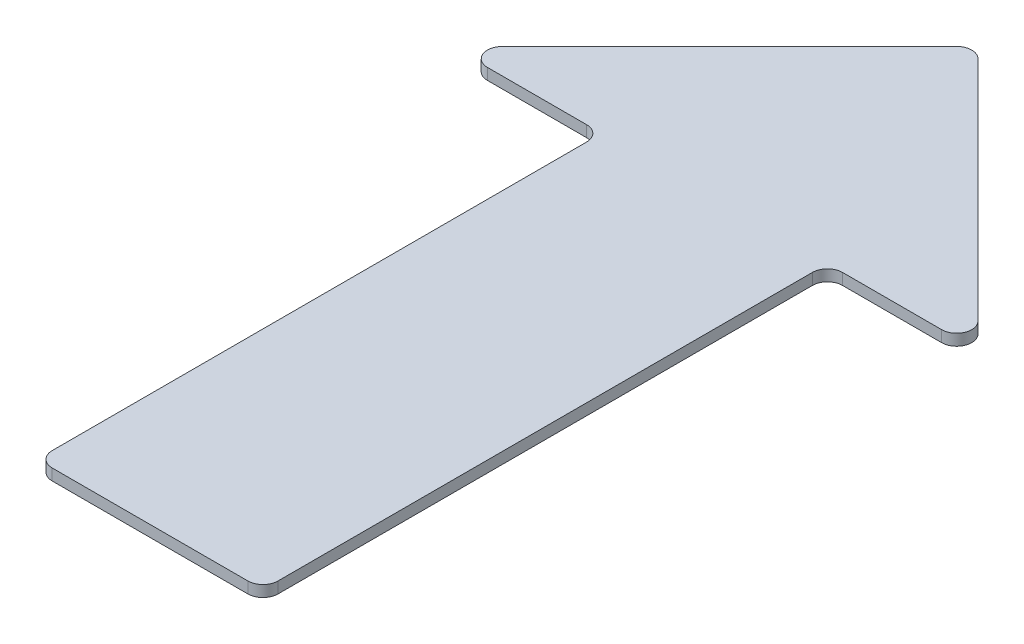
ISO-10303-21;
HEADER;
FILE_DESCRIPTION(('STEP AP214'),'2;1');
FILE_NAME('part.step','',(''),(''),'','','');
FILE_SCHEMA(('AUTOMOTIVE_DESIGN { 1 0 10303 214 1 1 1 1 }'));
ENDSEC;
DATA;
#1=APPLICATION_CONTEXT('core data for automotive mechanical design processes');
#2=APPLICATION_PROTOCOL_DEFINITION('international standard','automotive_design',2000,#1);
#3=PRODUCT_CONTEXT('',#1,'mechanical');
#4=PRODUCT('Part','Part','',(#3));
#5=PRODUCT_RELATED_PRODUCT_CATEGORY('part','',(#4));
#6=PRODUCT_DEFINITION_FORMATION('','',#4);
#7=PRODUCT_DEFINITION_CONTEXT('part definition',#1,'design');
#8=PRODUCT_DEFINITION('design','',#6,#7);
#9=PRODUCT_DEFINITION_SHAPE('','',#8);
#10=(LENGTH_UNIT() NAMED_UNIT(*) SI_UNIT(.MILLI.,.METRE.));
#11=(NAMED_UNIT(*) PLANE_ANGLE_UNIT() SI_UNIT($,.RADIAN.));
#12=(NAMED_UNIT(*) SI_UNIT($,.STERADIAN.) SOLID_ANGLE_UNIT());
#13=UNCERTAINTY_MEASURE_WITH_UNIT(LENGTH_MEASURE(1.E-05),#10,'distance_accuracy_value','');
#14=(GEOMETRIC_REPRESENTATION_CONTEXT(3) GLOBAL_UNCERTAINTY_ASSIGNED_CONTEXT((#13)) GLOBAL_UNIT_ASSIGNED_CONTEXT((#10,
#11,#12)) REPRESENTATION_CONTEXT('',''));
#15=CARTESIAN_POINT('',(0.,0.,0.));
#16=DIRECTION('',(0.,0.,1.));
#17=DIRECTION('',(1.,0.,0.));
#18=AXIS2_PLACEMENT_3D('',#15,#16,#17);
#19=CARTESIAN_POINT('',(0.,1.5,0.));
#20=DIRECTION('',(0.707106781186546,0.,0.707106781186548));
#21=DIRECTION('',(0.707106781186549,0.,-0.707106781186546));
#22=AXIS2_PLACEMENT_3D('',#19,#20,#21);
#23=PLANE('',#22);
#24=DIRECTION('',(-0.707106781186549,0.,0.707106781186546));
#25=VECTOR('',#24,1.);
#26=CARTESIAN_POINT('',(0.,1.5,0.));
#27=LINE('',#26,#25);
#28=CARTESIAN_POINT('',(-1.41421356237309,1.5,1.41421356237309));
#29=VERTEX_POINT('',#28);
#30=CARTESIAN_POINT('',(-31.585786437627,1.5,31.5857864376269));
#31=VERTEX_POINT('',#30);
#32=EDGE_CURVE('E156',#29,#31,#27,.T.);
#33=ORIENTED_EDGE('',*,*,#32,.F.);
#34=DIRECTION('',(0.,-1.,0.));
#35=VECTOR('',#34,1.);
#36=CARTESIAN_POINT('',(-1.41421356237309,1.5,1.41421356237309));
#37=LINE('',#36,#35);
#38=CARTESIAN_POINT('',(-1.41421356237309,0.,1.41421356237309));
#39=VERTEX_POINT('',#38);
#40=EDGE_CURVE('E141',#29,#39,#37,.T.);
#41=ORIENTED_EDGE('',*,*,#40,.T.);
#42=DIRECTION('',(-0.707106781186549,0.,0.707106781186546));
#43=VECTOR('',#42,1.);
#44=CARTESIAN_POINT('',(0.,0.,0.));
#45=LINE('',#44,#43);
#46=CARTESIAN_POINT('',(-31.585786437627,0.,31.5857864376269));
#47=VERTEX_POINT('',#46);
#48=EDGE_CURVE('E153',#39,#47,#45,.T.);
#49=ORIENTED_EDGE('',*,*,#48,.T.);
#50=DIRECTION('',(0.,-1.,0.));
#51=VECTOR('',#50,1.);
#52=CARTESIAN_POINT('',(-31.585786437627,1.5,31.5857864376269));
#53=LINE('',#52,#51);
#54=EDGE_CURVE('E158',#47,#31,#53,.F.);
#55=ORIENTED_EDGE('',*,*,#54,.T.);
#56=EDGE_LOOP('',(#33,#41,#49,#55));
#57=FACE_BOUND('',#56,.T.);
#58=ADVANCED_FACE('F35',(#57),#23,.F.);
#59=CARTESIAN_POINT('',(-35.0000000000001,1.5,35.));
#60=DIRECTION('',(0.,0.,-1.));
#61=DIRECTION('',(-1.,0.,0.));
#62=AXIS2_PLACEMENT_3D('',#59,#60,#61);
#63=PLANE('',#62);
#64=DIRECTION('',(1.,0.,0.));
#65=VECTOR('',#64,1.);
#66=CARTESIAN_POINT('',(-35.0000000000001,0.,35.));
#67=LINE('',#66,#65);
#68=CARTESIAN_POINT('',(-30.1715728752539,0.,35.));
#69=VERTEX_POINT('',#68);
#70=CARTESIAN_POINT('',(-17.,0.,35.));
#71=VERTEX_POINT('',#70);
#72=EDGE_CURVE('E163',#69,#71,#67,.T.);
#73=ORIENTED_EDGE('',*,*,#72,.T.);
#74=DIRECTION('',(0.,-1.,0.));
#75=VECTOR('',#74,1.);
#76=CARTESIAN_POINT('',(-17.,1.5,35.));
#77=LINE('',#76,#75);
#78=CARTESIAN_POINT('',(-17.,1.5,35.));
#79=VERTEX_POINT('',#78);
#80=EDGE_CURVE('E225',#71,#79,#77,.F.);
#81=ORIENTED_EDGE('',*,*,#80,.T.);
#82=DIRECTION('',(1.,0.,0.));
#83=VECTOR('',#82,1.);
#84=CARTESIAN_POINT('',(-35.0000000000001,1.5,35.));
#85=LINE('',#84,#83);
#86=CARTESIAN_POINT('',(-30.1715728752539,1.5,35.));
#87=VERTEX_POINT('',#86);
#88=EDGE_CURVE('E246',#87,#79,#85,.T.);
#89=ORIENTED_EDGE('',*,*,#88,.F.);
#90=DIRECTION('',(0.,-1.,0.));
#91=VECTOR('',#90,1.);
#92=CARTESIAN_POINT('',(-30.1715728752539,1.5,35.));
#93=LINE('',#92,#91);
#94=EDGE_CURVE('E222',#87,#69,#93,.T.);
#95=ORIENTED_EDGE('',*,*,#94,.T.);
#96=EDGE_LOOP('',(#73,#81,#89,#95));
#97=FACE_BOUND('',#96,.T.);
#98=ADVANCED_FACE('F234',(#97),#63,.F.);
#99=CARTESIAN_POINT('',(-15.,1.5,35.));
#100=DIRECTION('',(1.,0.,0.));
#101=DIRECTION('',(0.,0.,-1.));
#102=AXIS2_PLACEMENT_3D('',#99,#100,#101);
#103=PLANE('',#102);
#104=DIRECTION('',(0.,0.,1.));
#105=VECTOR('',#104,1.);
#106=CARTESIAN_POINT('',(-15.,0.,35.));
#107=LINE('',#106,#105);
#108=CARTESIAN_POINT('',(-15.,0.,37.));
#109=VERTEX_POINT('',#108);
#110=CARTESIAN_POINT('',(-15.,0.,108.));
#111=VERTEX_POINT('',#110);
#112=EDGE_CURVE('E166',#109,#111,#107,.T.);
#113=ORIENTED_EDGE('',*,*,#112,.T.);
#114=DIRECTION('',(0.,-1.,0.));
#115=VECTOR('',#114,1.);
#116=CARTESIAN_POINT('',(-15.,1.5,108.));
#117=LINE('',#116,#115);
#118=CARTESIAN_POINT('',(-15.,1.5,108.));
#119=VERTEX_POINT('',#118);
#120=EDGE_CURVE('E220',#111,#119,#117,.F.);
#121=ORIENTED_EDGE('',*,*,#120,.T.);
#122=DIRECTION('',(0.,0.,1.));
#123=VECTOR('',#122,1.);
#124=CARTESIAN_POINT('',(-15.,1.5,35.));
#125=LINE('',#124,#123);
#126=CARTESIAN_POINT('',(-15.,1.5,37.));
#127=VERTEX_POINT('',#126);
#128=EDGE_CURVE('E244',#127,#119,#125,.T.);
#129=ORIENTED_EDGE('',*,*,#128,.F.);
#130=DIRECTION('',(0.,-1.,0.));
#131=VECTOR('',#130,1.);
#132=CARTESIAN_POINT('',(-15.,0.,37.));
#133=LINE('',#132,#131);
#134=EDGE_CURVE('E217',#127,#109,#133,.T.);
#135=ORIENTED_EDGE('',*,*,#134,.T.);
#136=EDGE_LOOP('',(#113,#121,#129,#135));
#137=FACE_BOUND('',#136,.T.);
#138=ADVANCED_FACE('F248',(#137),#103,.F.);
#139=CARTESIAN_POINT('',(15.,1.5,110.));
#140=DIRECTION('',(0.,0.,-1.));
#141=DIRECTION('',(-1.,0.,0.));
#142=AXIS2_PLACEMENT_3D('',#139,#140,#141);
#143=PLANE('',#142);
#144=DIRECTION('',(1.,0.,0.));
#145=VECTOR('',#144,1.);
#146=CARTESIAN_POINT('',(15.,1.5,110.));
#147=LINE('',#146,#145);
#148=CARTESIAN_POINT('',(-13.,1.5,110.));
#149=VERTEX_POINT('',#148);
#150=CARTESIAN_POINT('',(13.,1.5,110.));
#151=VERTEX_POINT('',#150);
#152=EDGE_CURVE('E250',#149,#151,#147,.T.);
#153=ORIENTED_EDGE('',*,*,#152,.F.);
#154=DIRECTION('',(0.,-1.,0.));
#155=VECTOR('',#154,1.);
#156=CARTESIAN_POINT('',(-13.,1.5,110.));
#157=LINE('',#156,#155);
#158=CARTESIAN_POINT('',(-13.,0.,110.));
#159=VERTEX_POINT('',#158);
#160=EDGE_CURVE('E214',#149,#159,#157,.T.);
#161=ORIENTED_EDGE('',*,*,#160,.T.);
#162=DIRECTION('',(1.,0.,0.));
#163=VECTOR('',#162,1.);
#164=CARTESIAN_POINT('',(15.,0.,110.));
#165=LINE('',#164,#163);
#166=CARTESIAN_POINT('',(13.,0.,110.));
#167=VERTEX_POINT('',#166);
#168=EDGE_CURVE('E174',#159,#167,#165,.T.);
#169=ORIENTED_EDGE('',*,*,#168,.T.);
#170=DIRECTION('',(0.,-1.,0.));
#171=VECTOR('',#170,1.);
#172=CARTESIAN_POINT('',(13.,1.5,110.));
#173=LINE('',#172,#171);
#174=EDGE_CURVE('E212',#167,#151,#173,.F.);
#175=ORIENTED_EDGE('',*,*,#174,.T.);
#176=EDGE_LOOP('',(#153,#161,#169,#175));
#177=FACE_BOUND('',#176,.T.);
#178=ADVANCED_FACE('F283',(#177),#143,.F.);
#179=CARTESIAN_POINT('',(15.,1.5,35.));
#180=DIRECTION('',(-1.,0.,0.));
#181=DIRECTION('',(0.,0.,1.));
#182=AXIS2_PLACEMENT_3D('',#179,#180,#181);
#183=PLANE('',#182);
#184=DIRECTION('',(0.,0.,-1.));
#185=VECTOR('',#184,1.);
#186=CARTESIAN_POINT('',(15.,0.,35.));
#187=LINE('',#186,#185);
#188=CARTESIAN_POINT('',(15.,0.,108.));
#189=VERTEX_POINT('',#188);
#190=CARTESIAN_POINT('',(15.,0.,37.));
#191=VERTEX_POINT('',#190);
#192=EDGE_CURVE('E177',#189,#191,#187,.T.);
#193=ORIENTED_EDGE('',*,*,#192,.T.);
#194=DIRECTION('',(0.,-1.,0.));
#195=VECTOR('',#194,1.);
#196=CARTESIAN_POINT('',(15.,1.5,37.));
#197=LINE('',#196,#195);
#198=CARTESIAN_POINT('',(15.,1.5,37.));
#199=VERTEX_POINT('',#198);
#200=EDGE_CURVE('E210',#191,#199,#197,.F.);
#201=ORIENTED_EDGE('',*,*,#200,.T.);
#202=DIRECTION('',(0.,0.,-1.));
#203=VECTOR('',#202,1.);
#204=CARTESIAN_POINT('',(15.,1.5,35.));
#205=LINE('',#204,#203);
#206=CARTESIAN_POINT('',(15.,1.5,108.));
#207=VERTEX_POINT('',#206);
#208=EDGE_CURVE('E253',#207,#199,#205,.T.);
#209=ORIENTED_EDGE('',*,*,#208,.F.);
#210=DIRECTION('',(0.,-1.,0.));
#211=VECTOR('',#210,1.);
#212=CARTESIAN_POINT('',(15.,1.5,108.));
#213=LINE('',#212,#211);
#214=EDGE_CURVE('E207',#207,#189,#213,.T.);
#215=ORIENTED_EDGE('',*,*,#214,.T.);
#216=EDGE_LOOP('',(#193,#201,#209,#215));
#217=FACE_BOUND('',#216,.T.);
#218=ADVANCED_FACE('F274',(#217),#183,.F.);
#219=CARTESIAN_POINT('',(35.0000000000001,1.5,35.));
#220=DIRECTION('',(0.,0.,-1.));
#221=DIRECTION('',(-1.,0.,0.));
#222=AXIS2_PLACEMENT_3D('',#219,#220,#221);
#223=PLANE('',#222);
#224=DIRECTION('',(1.,0.,0.));
#225=VECTOR('',#224,1.);
#226=CARTESIAN_POINT('',(35.0000000000001,0.,35.));
#227=LINE('',#226,#225);
#228=CARTESIAN_POINT('',(17.,0.,35.));
#229=VERTEX_POINT('',#228);
#230=CARTESIAN_POINT('',(30.1715728752539,0.,35.));
#231=VERTEX_POINT('',#230);
#232=EDGE_CURVE('E180',#229,#231,#227,.T.);
#233=ORIENTED_EDGE('',*,*,#232,.T.);
#234=DIRECTION('',(0.,-1.,0.));
#235=VECTOR('',#234,1.);
#236=CARTESIAN_POINT('',(30.1715728752539,1.5,35.));
#237=LINE('',#236,#235);
#238=CARTESIAN_POINT('',(30.1715728752539,1.5,35.));
#239=VERTEX_POINT('',#238);
#240=EDGE_CURVE('E50',#231,#239,#237,.F.);
#241=ORIENTED_EDGE('',*,*,#240,.T.);
#242=DIRECTION('',(1.,0.,0.));
#243=VECTOR('',#242,1.);
#244=CARTESIAN_POINT('',(35.0000000000001,1.5,35.));
#245=LINE('',#244,#243);
#246=CARTESIAN_POINT('',(17.,1.5,35.));
#247=VERTEX_POINT('',#246);
#248=EDGE_CURVE('E258',#247,#239,#245,.T.);
#249=ORIENTED_EDGE('',*,*,#248,.F.);
#250=DIRECTION('',(0.,-1.,0.));
#251=VECTOR('',#250,1.);
#252=CARTESIAN_POINT('',(17.,0.,35.));
#253=LINE('',#252,#251);
#254=EDGE_CURVE('E203',#247,#229,#253,.T.);
#255=ORIENTED_EDGE('',*,*,#254,.T.);
#256=EDGE_LOOP('',(#233,#241,#249,#255));
#257=FACE_BOUND('',#256,.T.);
#258=ADVANCED_FACE('F267',(#257),#223,.F.);
#259=CARTESIAN_POINT('',(0.,1.5,0.));
#260=DIRECTION('',(-0.707106781186546,0.,0.707106781186549));
#261=DIRECTION('',(0.707106781186549,0.,0.707106781186546));
#262=AXIS2_PLACEMENT_3D('',#259,#260,#261);
#263=PLANE('',#262);
#264=DIRECTION('',(-0.707106781186549,0.,-0.707106781186546));
#265=VECTOR('',#264,1.);
#266=CARTESIAN_POINT('',(0.,0.,0.));
#267=LINE('',#266,#265);
#268=CARTESIAN_POINT('',(31.585786437627,0.,31.5857864376269));
#269=VERTEX_POINT('',#268);
#270=CARTESIAN_POINT('',(1.41421356237309,0.,1.41421356237309));
#271=VERTEX_POINT('',#270);
#272=EDGE_CURVE('E182',#269,#271,#267,.T.);
#273=ORIENTED_EDGE('',*,*,#272,.T.);
#274=DIRECTION('',(0.,-1.,0.));
#275=VECTOR('',#274,1.);
#276=CARTESIAN_POINT('',(1.41421356237309,1.5,1.41421356237309));
#277=LINE('',#276,#275);
#278=CARTESIAN_POINT('',(1.41421356237309,1.5,1.41421356237309));
#279=VERTEX_POINT('',#278);
#280=EDGE_CURVE('E142',#271,#279,#277,.F.);
#281=ORIENTED_EDGE('',*,*,#280,.T.);
#282=DIRECTION('',(-0.707106781186549,0.,-0.707106781186546));
#283=VECTOR('',#282,1.);
#284=CARTESIAN_POINT('',(0.,1.5,0.));
#285=LINE('',#284,#283);
#286=CARTESIAN_POINT('',(31.585786437627,1.5,31.5857864376269));
#287=VERTEX_POINT('',#286);
#288=EDGE_CURVE('E169',#287,#279,#285,.T.);
#289=ORIENTED_EDGE('',*,*,#288,.F.);
#290=DIRECTION('',(0.,-1.,0.));
#291=VECTOR('',#290,1.);
#292=CARTESIAN_POINT('',(31.585786437627,1.5,31.5857864376269));
#293=LINE('',#292,#291);
#294=EDGE_CURVE('E147',#287,#269,#293,.T.);
#295=ORIENTED_EDGE('',*,*,#294,.T.);
#296=EDGE_LOOP('',(#273,#281,#289,#295));
#297=FACE_BOUND('',#296,.T.);
#298=ADVANCED_FACE('F263',(#297),#263,.F.);
#299=CARTESIAN_POINT('',(0.,1.5,0.));
#300=DIRECTION('',(0.,1.,0.));
#301=DIRECTION('',(0.,0.,1.));
#302=AXIS2_PLACEMENT_3D('',#299,#300,#301);
#303=PLANE('',#302);
#304=ORIENTED_EDGE('',*,*,#288,.T.);
#305=CARTESIAN_POINT('',(0.,1.5,2.82842712474619));
#306=DIRECTION('',(0.,1.,0.));
#307=DIRECTION('',(0.,0.,1.));
#308=AXIS2_PLACEMENT_3D('',#305,#306,#307);
#309=CIRCLE('',#308,2.);
#310=EDGE_CURVE('E201',#279,#29,#309,.T.);
#311=ORIENTED_EDGE('',*,*,#310,.T.);
#312=ORIENTED_EDGE('',*,*,#32,.T.);
#313=CARTESIAN_POINT('',(-30.1715728752539,1.5,33.));
#314=DIRECTION('',(0.,1.,0.));
#315=DIRECTION('',(0.,0.,1.));
#316=AXIS2_PLACEMENT_3D('',#313,#314,#315);
#317=CIRCLE('',#316,2.);
#318=EDGE_CURVE('E195',#31,#87,#317,.T.);
#319=ORIENTED_EDGE('',*,*,#318,.T.);
#320=ORIENTED_EDGE('',*,*,#88,.T.);
#321=CARTESIAN_POINT('',(-17.,1.5,37.));
#322=DIRECTION('',(0.,1.,0.));
#323=DIRECTION('',(0.,0.,1.));
#324=AXIS2_PLACEMENT_3D('',#321,#322,#323);
#325=CIRCLE('',#324,2.);
#326=EDGE_CURVE('E11',#79,#127,#325,.F.);
#327=ORIENTED_EDGE('',*,*,#326,.T.);
#328=ORIENTED_EDGE('',*,*,#128,.T.);
#329=CARTESIAN_POINT('',(-13.,1.5,108.));
#330=DIRECTION('',(0.,1.,0.));
#331=DIRECTION('',(0.,0.,1.));
#332=AXIS2_PLACEMENT_3D('',#329,#330,#331);
#333=CIRCLE('',#332,2.);
#334=EDGE_CURVE('E197',#119,#149,#333,.T.);
#335=ORIENTED_EDGE('',*,*,#334,.T.);
#336=ORIENTED_EDGE('',*,*,#152,.T.);
#337=CARTESIAN_POINT('',(13.,1.5,108.));
#338=DIRECTION('',(0.,1.,0.));
#339=DIRECTION('',(0.,0.,1.));
#340=AXIS2_PLACEMENT_3D('',#337,#338,#339);
#341=CIRCLE('',#340,2.);
#342=EDGE_CURVE('E193',#151,#207,#341,.T.);
#343=ORIENTED_EDGE('',*,*,#342,.T.);
#344=ORIENTED_EDGE('',*,*,#208,.T.);
#345=CARTESIAN_POINT('',(17.,1.5,37.));
#346=DIRECTION('',(0.,1.,0.));
#347=DIRECTION('',(0.,0.,1.));
#348=AXIS2_PLACEMENT_3D('',#345,#346,#347);
#349=CIRCLE('',#348,2.);
#350=EDGE_CURVE('E57',#199,#247,#349,.F.);
#351=ORIENTED_EDGE('',*,*,#350,.T.);
#352=ORIENTED_EDGE('',*,*,#248,.T.);
#353=CARTESIAN_POINT('',(30.1715728752539,1.5,33.));
#354=DIRECTION('',(0.,1.,0.));
#355=DIRECTION('',(0.,0.,1.));
#356=AXIS2_PLACEMENT_3D('',#353,#354,#355);
#357=CIRCLE('',#356,2.);
#358=EDGE_CURVE('E199',#239,#287,#357,.T.);
#359=ORIENTED_EDGE('',*,*,#358,.T.);
#360=EDGE_LOOP('',(#304,#311,#312,#319,#320,#327,#328,#335,#336,#343,#344,#351,#352,#359));
#361=FACE_BOUND('',#360,.T.);
#362=ADVANCED_FACE('F243',(#361),#303,.T.);
#363=CARTESIAN_POINT('',(0.,0.,0.));
#364=DIRECTION('',(0.,1.,0.));
#365=DIRECTION('',(0.,0.,1.));
#366=AXIS2_PLACEMENT_3D('',#363,#364,#365);
#367=PLANE('',#366);
#368=ORIENTED_EDGE('',*,*,#48,.F.);
#369=CARTESIAN_POINT('',(0.,0.,2.82842712474619));
#370=DIRECTION('',(0.,1.,0.));
#371=DIRECTION('',(0.,0.,1.));
#372=AXIS2_PLACEMENT_3D('',#369,#370,#371);
#373=CIRCLE('',#372,2.);
#374=EDGE_CURVE('E137',#39,#271,#373,.F.);
#375=ORIENTED_EDGE('',*,*,#374,.T.);
#376=ORIENTED_EDGE('',*,*,#272,.F.);
#377=CARTESIAN_POINT('',(30.1715728752539,0.,33.));
#378=DIRECTION('',(0.,1.,0.));
#379=DIRECTION('',(0.,0.,1.));
#380=AXIS2_PLACEMENT_3D('',#377,#378,#379);
#381=CIRCLE('',#380,2.);
#382=EDGE_CURVE('E148',#269,#231,#381,.F.);
#383=ORIENTED_EDGE('',*,*,#382,.T.);
#384=ORIENTED_EDGE('',*,*,#232,.F.);
#385=CARTESIAN_POINT('',(17.,0.,37.));
#386=DIRECTION('',(0.,1.,0.));
#387=DIRECTION('',(0.,0.,1.));
#388=AXIS2_PLACEMENT_3D('',#385,#386,#387);
#389=CIRCLE('',#388,2.);
#390=EDGE_CURVE('E227',#229,#191,#389,.T.);
#391=ORIENTED_EDGE('',*,*,#390,.T.);
#392=ORIENTED_EDGE('',*,*,#192,.F.);
#393=CARTESIAN_POINT('',(13.,0.,108.));
#394=DIRECTION('',(0.,1.,0.));
#395=DIRECTION('',(0.,0.,1.));
#396=AXIS2_PLACEMENT_3D('',#393,#394,#395);
#397=CIRCLE('',#396,2.);
#398=EDGE_CURVE('E157',#189,#167,#397,.F.);
#399=ORIENTED_EDGE('',*,*,#398,.T.);
#400=ORIENTED_EDGE('',*,*,#168,.F.);
#401=CARTESIAN_POINT('',(-13.,0.,108.));
#402=DIRECTION('',(0.,1.,0.));
#403=DIRECTION('',(0.,0.,1.));
#404=AXIS2_PLACEMENT_3D('',#401,#402,#403);
#405=CIRCLE('',#404,2.);
#406=EDGE_CURVE('E187',#159,#111,#405,.F.);
#407=ORIENTED_EDGE('',*,*,#406,.T.);
#408=ORIENTED_EDGE('',*,*,#112,.F.);
#409=CARTESIAN_POINT('',(-17.,0.,37.));
#410=DIRECTION('',(0.,1.,0.));
#411=DIRECTION('',(0.,0.,1.));
#412=AXIS2_PLACEMENT_3D('',#409,#410,#411);
#413=CIRCLE('',#412,2.);
#414=EDGE_CURVE('E43',#109,#71,#413,.T.);
#415=ORIENTED_EDGE('',*,*,#414,.T.);
#416=ORIENTED_EDGE('',*,*,#72,.F.);
#417=CARTESIAN_POINT('',(-30.1715728752539,0.,33.));
#418=DIRECTION('',(0.,1.,0.));
#419=DIRECTION('',(0.,0.,1.));
#420=AXIS2_PLACEMENT_3D('',#417,#418,#419);
#421=CIRCLE('',#420,2.);
#422=EDGE_CURVE('E162',#69,#47,#421,.F.);
#423=ORIENTED_EDGE('',*,*,#422,.T.);
#424=EDGE_LOOP('',(#368,#375,#376,#383,#384,#391,#392,#399,#400,#407,#408,#415,#416,#423));
#425=FACE_BOUND('',#424,.T.);
#426=ADVANCED_FACE('F160',(#425),#367,.F.);
#427=CARTESIAN_POINT('',(0.,1.5,2.82842712474619));
#428=DIRECTION('',(0.,-1.,0.));
#429=DIRECTION('',(0.,0.,-1.));
#430=AXIS2_PLACEMENT_3D('',#427,#428,#429);
#431=CYLINDRICAL_SURFACE('',#430,2.);
#432=ORIENTED_EDGE('',*,*,#310,.F.);
#433=ORIENTED_EDGE('',*,*,#280,.F.);
#434=ORIENTED_EDGE('',*,*,#374,.F.);
#435=ORIENTED_EDGE('',*,*,#40,.F.);
#436=EDGE_LOOP('',(#432,#433,#434,#435));
#437=FACE_BOUND('',#436,.T.);
#438=ADVANCED_FACE('F140',(#437),#431,.T.);
#439=CARTESIAN_POINT('',(30.1715728752539,1.5,33.));
#440=DIRECTION('',(0.,-1.,0.));
#441=DIRECTION('',(0.,0.,-1.));
#442=AXIS2_PLACEMENT_3D('',#439,#440,#441);
#443=CYLINDRICAL_SURFACE('',#442,2.);
#444=ORIENTED_EDGE('',*,*,#358,.F.);
#445=ORIENTED_EDGE('',*,*,#240,.F.);
#446=ORIENTED_EDGE('',*,*,#382,.F.);
#447=ORIENTED_EDGE('',*,*,#294,.F.);
#448=EDGE_LOOP('',(#444,#445,#446,#447));
#449=FACE_BOUND('',#448,.T.);
#450=ADVANCED_FACE('F265',(#449),#443,.T.);
#451=CARTESIAN_POINT('',(17.,1.5,37.));
#452=DIRECTION('',(0.,1.,0.));
#453=DIRECTION('',(0.,0.,1.));
#454=AXIS2_PLACEMENT_3D('',#451,#452,#453);
#455=CYLINDRICAL_SURFACE('',#454,2.);
#456=ORIENTED_EDGE('',*,*,#350,.F.);
#457=ORIENTED_EDGE('',*,*,#200,.F.);
#458=ORIENTED_EDGE('',*,*,#390,.F.);
#459=ORIENTED_EDGE('',*,*,#254,.F.);
#460=EDGE_LOOP('',(#456,#457,#458,#459));
#461=FACE_BOUND('',#460,.T.);
#462=ADVANCED_FACE('F270',(#461),#455,.F.);
#463=CARTESIAN_POINT('',(-13.,1.5,108.));
#464=DIRECTION('',(0.,-1.,0.));
#465=DIRECTION('',(0.,0.,-1.));
#466=AXIS2_PLACEMENT_3D('',#463,#464,#465);
#467=CYLINDRICAL_SURFACE('',#466,2.);
#468=ORIENTED_EDGE('',*,*,#334,.F.);
#469=ORIENTED_EDGE('',*,*,#120,.F.);
#470=ORIENTED_EDGE('',*,*,#406,.F.);
#471=ORIENTED_EDGE('',*,*,#160,.F.);
#472=EDGE_LOOP('',(#468,#469,#470,#471));
#473=FACE_BOUND('',#472,.T.);
#474=ADVANCED_FACE('F286',(#473),#467,.T.);
#475=CARTESIAN_POINT('',(-17.,1.5,37.));
#476=DIRECTION('',(0.,1.,0.));
#477=DIRECTION('',(0.,0.,1.));
#478=AXIS2_PLACEMENT_3D('',#475,#476,#477);
#479=CYLINDRICAL_SURFACE('',#478,2.);
#480=ORIENTED_EDGE('',*,*,#326,.F.);
#481=ORIENTED_EDGE('',*,*,#80,.F.);
#482=ORIENTED_EDGE('',*,*,#414,.F.);
#483=ORIENTED_EDGE('',*,*,#134,.F.);
#484=EDGE_LOOP('',(#480,#481,#482,#483));
#485=FACE_BOUND('',#484,.T.);
#486=ADVANCED_FACE('F239',(#485),#479,.F.);
#487=CARTESIAN_POINT('',(-30.1715728752539,1.5,33.));
#488=DIRECTION('',(0.,-1.,0.));
#489=DIRECTION('',(0.,0.,-1.));
#490=AXIS2_PLACEMENT_3D('',#487,#488,#489);
#491=CYLINDRICAL_SURFACE('',#490,2.);
#492=ORIENTED_EDGE('',*,*,#318,.F.);
#493=ORIENTED_EDGE('',*,*,#54,.F.);
#494=ORIENTED_EDGE('',*,*,#422,.F.);
#495=ORIENTED_EDGE('',*,*,#94,.F.);
#496=EDGE_LOOP('',(#492,#493,#494,#495));
#497=FACE_BOUND('',#496,.T.);
#498=ADVANCED_FACE('F293',(#497),#491,.T.);
#499=CARTESIAN_POINT('',(13.,1.5,108.));
#500=DIRECTION('',(0.,-1.,0.));
#501=DIRECTION('',(0.,0.,-1.));
#502=AXIS2_PLACEMENT_3D('',#499,#500,#501);
#503=CYLINDRICAL_SURFACE('',#502,2.);
#504=ORIENTED_EDGE('',*,*,#342,.F.);
#505=ORIENTED_EDGE('',*,*,#174,.F.);
#506=ORIENTED_EDGE('',*,*,#398,.F.);
#507=ORIENTED_EDGE('',*,*,#214,.F.);
#508=EDGE_LOOP('',(#504,#505,#506,#507));
#509=FACE_BOUND('',#508,.T.);
#510=ADVANCED_FACE('F37',(#509),#503,.T.);
#511=CLOSED_SHELL('',(#58,#98,#138,#178,#218,#258,#298,#362,#426,#438,#450,#462,#474,#486,#498,#510));
#512=MANIFOLD_SOLID_BREP('B2',#511);
#513=ADVANCED_BREP_SHAPE_REPRESENTATION('',(#18,#512),#14);
#514=SHAPE_DEFINITION_REPRESENTATION(#9,#513);
ENDSEC;
END-ISO-10303-21;
